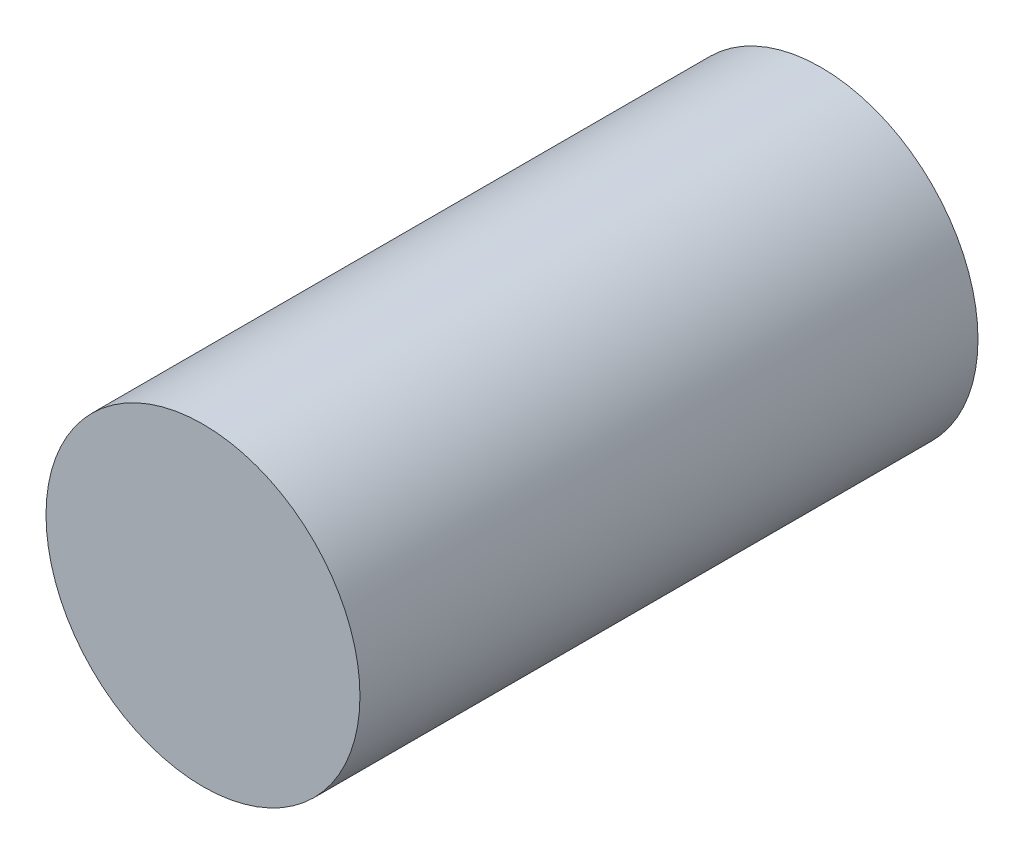
ISO-10303-21;
HEADER;
FILE_DESCRIPTION(('STEP AP214'),'2;1');
FILE_NAME('part.step','',(''),(''),'','','');
FILE_SCHEMA(('AUTOMOTIVE_DESIGN { 1 0 10303 214 1 1 1 1 }'));
ENDSEC;
DATA;
#1=APPLICATION_CONTEXT('core data for automotive mechanical design processes');
#2=APPLICATION_PROTOCOL_DEFINITION('international standard','automotive_design',2000,#1);
#3=PRODUCT_CONTEXT('',#1,'mechanical');
#4=PRODUCT('Part','Part','',(#3));
#5=PRODUCT_RELATED_PRODUCT_CATEGORY('part','',(#4));
#6=PRODUCT_DEFINITION_FORMATION('','',#4);
#7=PRODUCT_DEFINITION_CONTEXT('part definition',#1,'design');
#8=PRODUCT_DEFINITION('design','',#6,#7);
#9=PRODUCT_DEFINITION_SHAPE('','',#8);
#10=(LENGTH_UNIT() NAMED_UNIT(*) SI_UNIT(.MILLI.,.METRE.));
#11=(NAMED_UNIT(*) PLANE_ANGLE_UNIT() SI_UNIT($,.RADIAN.));
#12=(NAMED_UNIT(*) SI_UNIT($,.STERADIAN.) SOLID_ANGLE_UNIT());
#13=UNCERTAINTY_MEASURE_WITH_UNIT(LENGTH_MEASURE(1.E-05),#10,'distance_accuracy_value','');
#14=(GEOMETRIC_REPRESENTATION_CONTEXT(3) GLOBAL_UNCERTAINTY_ASSIGNED_CONTEXT((#13)) GLOBAL_UNIT_ASSIGNED_CONTEXT((#10,
#11,#12)) REPRESENTATION_CONTEXT('',''));
#15=CARTESIAN_POINT('',(0.,0.,0.));
#16=DIRECTION('',(0.,0.,1.));
#17=DIRECTION('',(1.,0.,0.));
#18=AXIS2_PLACEMENT_3D('',#15,#16,#17);
#19=CARTESIAN_POINT('',(0.,0.,50.));
#20=DIRECTION('',(0.,0.,-1.));
#21=DIRECTION('',(-1.,0.,0.));
#22=AXIS2_PLACEMENT_3D('',#19,#20,#21);
#23=CYLINDRICAL_SURFACE('',#22,12.7);
#24=CARTESIAN_POINT('',(0.,0.,50.));
#25=DIRECTION('',(0.,0.,1.));
#26=DIRECTION('',(1.,0.,0.));
#27=AXIS2_PLACEMENT_3D('',#24,#25,#26);
#28=CIRCLE('',#27,12.7);
#29=CARTESIAN_POINT('',(12.7,0.,50.));
#30=VERTEX_POINT('',#29);
#31=EDGE_CURVE('E10',#30,#30,#28,.T.);
#32=ORIENTED_EDGE('',*,*,#31,.F.);
#33=EDGE_LOOP('',(#32));
#34=FACE_BOUND('',#33,.T.);
#35=CARTESIAN_POINT('',(0.,0.,0.));
#36=DIRECTION('',(0.,0.,1.));
#37=DIRECTION('',(1.,0.,0.));
#38=AXIS2_PLACEMENT_3D('',#35,#36,#37);
#39=CIRCLE('',#38,12.7);
#40=CARTESIAN_POINT('',(12.7,0.,0.));
#41=VERTEX_POINT('',#40);
#42=EDGE_CURVE('E36',#41,#41,#39,.T.);
#43=ORIENTED_EDGE('',*,*,#42,.T.);
#44=EDGE_LOOP('',(#43));
#45=FACE_BOUND('',#44,.T.);
#46=ADVANCED_FACE('F33',(#34,#45),#23,.T.);
#47=CARTESIAN_POINT('',(0.,0.,50.));
#48=DIRECTION('',(0.,0.,1.));
#49=DIRECTION('',(1.,0.,0.));
#50=AXIS2_PLACEMENT_3D('',#47,#48,#49);
#51=PLANE('',#50);
#52=ORIENTED_EDGE('',*,*,#31,.T.);
#53=EDGE_LOOP('',(#52));
#54=FACE_BOUND('',#53,.T.);
#55=ADVANCED_FACE('F48',(#54),#51,.T.);
#56=CARTESIAN_POINT('',(0.,0.,0.));
#57=DIRECTION('',(0.,0.,1.));
#58=DIRECTION('',(1.,0.,0.));
#59=AXIS2_PLACEMENT_3D('',#56,#57,#58);
#60=PLANE('',#59);
#61=ORIENTED_EDGE('',*,*,#42,.F.);
#62=EDGE_LOOP('',(#61));
#63=FACE_BOUND('',#62,.T.);
#64=ADVANCED_FACE('F46',(#63),#60,.F.);
#65=CLOSED_SHELL('',(#46,#55,#64));
#66=MANIFOLD_SOLID_BREP('B2',#65);
#67=ADVANCED_BREP_SHAPE_REPRESENTATION('',(#18,#66),#14);
#68=SHAPE_DEFINITION_REPRESENTATION(#9,#67);
ENDSEC;
END-ISO-10303-21;
